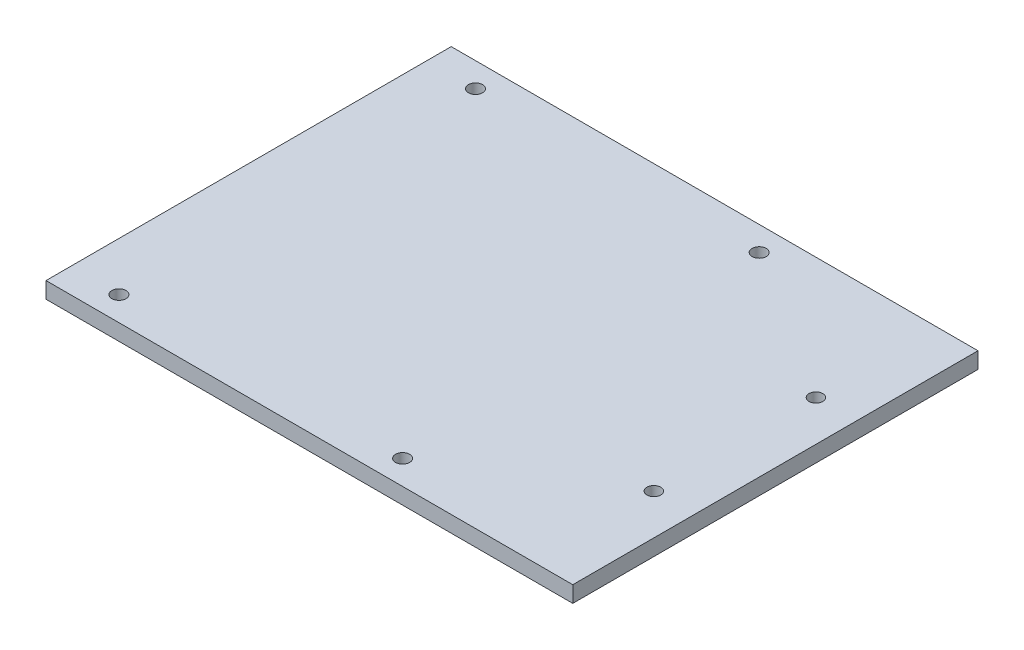
ISO-10303-21;
HEADER;
FILE_DESCRIPTION(('STEP AP214'),'2;1');
FILE_NAME('part.step','',(''),(''),'','','');
FILE_SCHEMA(('AUTOMOTIVE_DESIGN { 1 0 10303 214 1 1 1 1 }'));
ENDSEC;
DATA;
#1=APPLICATION_CONTEXT('core data for automotive mechanical design processes');
#2=APPLICATION_PROTOCOL_DEFINITION('international standard','automotive_design',2000,#1);
#3=PRODUCT_CONTEXT('',#1,'mechanical');
#4=PRODUCT('Part','Part','',(#3));
#5=PRODUCT_RELATED_PRODUCT_CATEGORY('part','',(#4));
#6=PRODUCT_DEFINITION_FORMATION('','',#4);
#7=PRODUCT_DEFINITION_CONTEXT('part definition',#1,'design');
#8=PRODUCT_DEFINITION('design','',#6,#7);
#9=PRODUCT_DEFINITION_SHAPE('','',#8);
#10=(LENGTH_UNIT() NAMED_UNIT(*) SI_UNIT(.MILLI.,.METRE.));
#11=(NAMED_UNIT(*) PLANE_ANGLE_UNIT() SI_UNIT($,.RADIAN.));
#12=(NAMED_UNIT(*) SI_UNIT($,.STERADIAN.) SOLID_ANGLE_UNIT());
#13=UNCERTAINTY_MEASURE_WITH_UNIT(LENGTH_MEASURE(1.E-05),#10,'distance_accuracy_value','');
#14=(GEOMETRIC_REPRESENTATION_CONTEXT(3) GLOBAL_UNCERTAINTY_ASSIGNED_CONTEXT((#13)) GLOBAL_UNIT_ASSIGNED_CONTEXT((#10,
#11,#12)) REPRESENTATION_CONTEXT('',''));
#15=CARTESIAN_POINT('',(0.,0.,0.));
#16=DIRECTION('',(0.,0.,1.));
#17=DIRECTION('',(1.,0.,0.));
#18=AXIS2_PLACEMENT_3D('',#15,#16,#17);
#19=CARTESIAN_POINT('',(0.,4.,0.));
#20=DIRECTION('',(1.,0.,0.));
#21=DIRECTION('',(0.,0.,-1.));
#22=AXIS2_PLACEMENT_3D('',#19,#20,#21);
#23=PLANE('',#22);
#24=DIRECTION('',(0.,0.,1.));
#25=VECTOR('',#24,1.);
#26=CARTESIAN_POINT('',(0.,0.,0.));
#27=LINE('',#26,#25);
#28=CARTESIAN_POINT('',(0.,0.,-100.));
#29=VERTEX_POINT('',#28);
#30=CARTESIAN_POINT('',(0.,0.,-50.));
#31=VERTEX_POINT('',#30);
#32=EDGE_CURVE('E175',#29,#31,#27,.T.);
#33=ORIENTED_EDGE('',*,*,#32,.T.);
#34=CARTESIAN_POINT('',(0.,0.,0.));
#35=VERTEX_POINT('',#34);
#36=EDGE_CURVE('E158',#31,#35,#27,.T.);
#37=ORIENTED_EDGE('',*,*,#36,.T.);
#38=DIRECTION('',(0.,-1.,0.));
#39=VECTOR('',#38,1.);
#40=CARTESIAN_POINT('',(0.,4.,0.));
#41=LINE('',#40,#39);
#42=CARTESIAN_POINT('',(0.,4.,0.));
#43=VERTEX_POINT('',#42);
#44=EDGE_CURVE('E11',#43,#35,#41,.T.);
#45=ORIENTED_EDGE('',*,*,#44,.F.);
#46=DIRECTION('',(0.,0.,1.));
#47=VECTOR('',#46,1.);
#48=CARTESIAN_POINT('',(0.,4.,0.));
#49=LINE('',#48,#47);
#50=CARTESIAN_POINT('',(0.,4.,-100.));
#51=VERTEX_POINT('',#50);
#52=EDGE_CURVE('E164',#51,#43,#49,.T.);
#53=ORIENTED_EDGE('',*,*,#52,.F.);
#54=DIRECTION('',(0.,-1.,0.));
#55=VECTOR('',#54,1.);
#56=CARTESIAN_POINT('',(0.,4.,-100.));
#57=LINE('',#56,#55);
#58=EDGE_CURVE('E174',#51,#29,#57,.T.);
#59=ORIENTED_EDGE('',*,*,#58,.T.);
#60=EDGE_LOOP('',(#33,#37,#45,#53,#59));
#61=FACE_BOUND('',#60,.T.);
#62=ADVANCED_FACE('F45',(#61),#23,.F.);
#63=CARTESIAN_POINT('',(0.,4.,0.));
#64=DIRECTION('',(0.,0.,-1.));
#65=DIRECTION('',(-1.,0.,0.));
#66=AXIS2_PLACEMENT_3D('',#63,#64,#65);
#67=PLANE('',#66);
#68=DIRECTION('',(1.,0.,0.));
#69=VECTOR('',#68,1.);
#70=CARTESIAN_POINT('',(0.,0.,0.));
#71=LINE('',#70,#69);
#72=CARTESIAN_POINT('',(130.,0.,0.));
#73=VERTEX_POINT('',#72);
#74=EDGE_CURVE('E178',#35,#73,#71,.T.);
#75=ORIENTED_EDGE('',*,*,#74,.T.);
#76=DIRECTION('',(0.,-1.,0.));
#77=VECTOR('',#76,1.);
#78=CARTESIAN_POINT('',(130.,4.,0.));
#79=LINE('',#78,#77);
#80=CARTESIAN_POINT('',(130.,4.,0.));
#81=VERTEX_POINT('',#80);
#82=EDGE_CURVE('E53',#81,#73,#79,.T.);
#83=ORIENTED_EDGE('',*,*,#82,.F.);
#84=DIRECTION('',(1.,0.,0.));
#85=VECTOR('',#84,1.);
#86=CARTESIAN_POINT('',(0.,4.,0.));
#87=LINE('',#86,#85);
#88=EDGE_CURVE('E167',#43,#81,#87,.T.);
#89=ORIENTED_EDGE('',*,*,#88,.F.);
#90=ORIENTED_EDGE('',*,*,#44,.T.);
#91=EDGE_LOOP('',(#75,#83,#89,#90));
#92=FACE_BOUND('',#91,.T.);
#93=ADVANCED_FACE('F281',(#92),#67,.F.);
#94=CARTESIAN_POINT('',(130.,4.,0.));
#95=DIRECTION('',(-1.,0.,0.));
#96=DIRECTION('',(0.,0.,1.));
#97=AXIS2_PLACEMENT_3D('',#94,#95,#96);
#98=PLANE('',#97);
#99=DIRECTION('',(0.,0.,-1.));
#100=VECTOR('',#99,1.);
#101=CARTESIAN_POINT('',(130.,0.,0.));
#102=LINE('',#101,#100);
#103=CARTESIAN_POINT('',(130.,0.,-100.));
#104=VERTEX_POINT('',#103);
#105=EDGE_CURVE('E180',#73,#104,#102,.T.);
#106=ORIENTED_EDGE('',*,*,#105,.T.);
#107=DIRECTION('',(0.,-1.,0.));
#108=VECTOR('',#107,1.);
#109=CARTESIAN_POINT('',(130.,4.,-100.));
#110=LINE('',#109,#108);
#111=CARTESIAN_POINT('',(130.,4.,-100.));
#112=VERTEX_POINT('',#111);
#113=EDGE_CURVE('E185',#112,#104,#110,.T.);
#114=ORIENTED_EDGE('',*,*,#113,.F.);
#115=DIRECTION('',(0.,0.,-1.));
#116=VECTOR('',#115,1.);
#117=CARTESIAN_POINT('',(130.,4.,0.));
#118=LINE('',#117,#116);
#119=EDGE_CURVE('E170',#81,#112,#118,.T.);
#120=ORIENTED_EDGE('',*,*,#119,.F.);
#121=ORIENTED_EDGE('',*,*,#82,.T.);
#122=EDGE_LOOP('',(#106,#114,#120,#121));
#123=FACE_BOUND('',#122,.T.);
#124=ADVANCED_FACE('F285',(#123),#98,.F.);
#125=CARTESIAN_POINT('',(0.,4.,-100.));
#126=DIRECTION('',(0.,0.,1.));
#127=DIRECTION('',(1.,0.,0.));
#128=AXIS2_PLACEMENT_3D('',#125,#126,#127);
#129=PLANE('',#128);
#130=DIRECTION('',(-1.,0.,0.));
#131=VECTOR('',#130,1.);
#132=CARTESIAN_POINT('',(0.,0.,-100.));
#133=LINE('',#132,#131);
#134=EDGE_CURVE('E168',#104,#29,#133,.T.);
#135=ORIENTED_EDGE('',*,*,#134,.T.);
#136=ORIENTED_EDGE('',*,*,#58,.F.);
#137=DIRECTION('',(-1.,0.,0.));
#138=VECTOR('',#137,1.);
#139=CARTESIAN_POINT('',(0.,4.,-100.));
#140=LINE('',#139,#138);
#141=EDGE_CURVE('E172',#112,#51,#140,.T.);
#142=ORIENTED_EDGE('',*,*,#141,.F.);
#143=ORIENTED_EDGE('',*,*,#113,.T.);
#144=EDGE_LOOP('',(#135,#136,#142,#143));
#145=FACE_BOUND('',#144,.T.);
#146=ADVANCED_FACE('F269',(#145),#129,.F.);
#147=CARTESIAN_POINT('',(0.,4.,0.));
#148=DIRECTION('',(0.,-1.,0.));
#149=DIRECTION('',(0.,0.,-1.));
#150=AXIS2_PLACEMENT_3D('',#147,#148,#149);
#151=PLANE('',#150);
#152=CARTESIAN_POINT('',(12.,4.,-94.));
#153=DIRECTION('',(0.,1.,0.));
#154=DIRECTION('',(0.,0.,-1.));
#155=AXIS2_PLACEMENT_3D('',#152,#153,#154);
#156=CIRCLE('',#155,1.75);
#157=CARTESIAN_POINT('',(12.,4.,-95.75));
#158=VERTEX_POINT('',#157);
#159=EDGE_CURVE('E255',#158,#158,#156,.T.);
#160=ORIENTED_EDGE('',*,*,#159,.F.);
#161=EDGE_LOOP('',(#160));
#162=FACE_BOUND('',#161,.T.);
#163=CARTESIAN_POINT('',(82.,4.,-94.));
#164=DIRECTION('',(0.,1.,0.));
#165=DIRECTION('',(0.,0.,-1.));
#166=AXIS2_PLACEMENT_3D('',#163,#164,#165);
#167=CIRCLE('',#166,1.75);
#168=CARTESIAN_POINT('',(82.,4.,-95.75));
#169=VERTEX_POINT('',#168);
#170=EDGE_CURVE('E258',#169,#169,#167,.T.);
#171=ORIENTED_EDGE('',*,*,#170,.F.);
#172=EDGE_LOOP('',(#171));
#173=FACE_BOUND('',#172,.T.);
#174=CARTESIAN_POINT('',(82.,4.,-6.));
#175=DIRECTION('',(0.,1.,0.));
#176=DIRECTION('',(0.,0.,1.));
#177=AXIS2_PLACEMENT_3D('',#174,#175,#176);
#178=CIRCLE('',#177,1.75);
#179=CARTESIAN_POINT('',(82.,4.,-4.25));
#180=VERTEX_POINT('',#179);
#181=EDGE_CURVE('E254',#180,#180,#178,.T.);
#182=ORIENTED_EDGE('',*,*,#181,.F.);
#183=EDGE_LOOP('',(#182));
#184=FACE_BOUND('',#183,.T.);
#185=CARTESIAN_POINT('',(12.,4.,-6.00000000000001));
#186=DIRECTION('',(0.,1.,0.));
#187=DIRECTION('',(0.,0.,1.));
#188=AXIS2_PLACEMENT_3D('',#185,#186,#187);
#189=CIRCLE('',#188,1.75);
#190=CARTESIAN_POINT('',(12.,4.,-4.25000000000001));
#191=VERTEX_POINT('',#190);
#192=EDGE_CURVE('E194',#191,#191,#189,.T.);
#193=ORIENTED_EDGE('',*,*,#192,.F.);
#194=EDGE_LOOP('',(#193));
#195=FACE_BOUND('',#194,.T.);
#196=CARTESIAN_POINT('',(120.,4.,-30.));
#197=DIRECTION('',(0.,1.,0.));
#198=DIRECTION('',(0.,0.,1.));
#199=AXIS2_PLACEMENT_3D('',#196,#197,#198);
#200=CIRCLE('',#199,1.70000000000001);
#201=CARTESIAN_POINT('',(120.,4.,-28.3));
#202=VERTEX_POINT('',#201);
#203=EDGE_CURVE('E159',#202,#202,#200,.T.);
#204=ORIENTED_EDGE('',*,*,#203,.F.);
#205=EDGE_LOOP('',(#204));
#206=FACE_BOUND('',#205,.T.);
#207=CARTESIAN_POINT('',(120.,4.,-70.));
#208=DIRECTION('',(0.,1.,0.));
#209=DIRECTION('',(0.,0.,1.));
#210=AXIS2_PLACEMENT_3D('',#207,#208,#209);
#211=CIRCLE('',#210,1.70000000000001);
#212=CARTESIAN_POINT('',(120.,4.,-68.3));
#213=VERTEX_POINT('',#212);
#214=EDGE_CURVE('E149',#213,#213,#211,.T.);
#215=ORIENTED_EDGE('',*,*,#214,.F.);
#216=EDGE_LOOP('',(#215));
#217=FACE_BOUND('',#216,.T.);
#218=ORIENTED_EDGE('',*,*,#52,.T.);
#219=ORIENTED_EDGE('',*,*,#88,.T.);
#220=ORIENTED_EDGE('',*,*,#119,.T.);
#221=ORIENTED_EDGE('',*,*,#141,.T.);
#222=EDGE_LOOP('',(#218,#219,#220,#221));
#223=FACE_BOUND('',#222,.T.);
#224=ADVANCED_FACE('F266',(#162,#173,#184,#195,#206,#217,#223),#151,.F.);
#225=CARTESIAN_POINT('',(0.,0.,0.));
#226=DIRECTION('',(0.,-1.,0.));
#227=DIRECTION('',(0.,0.,-1.));
#228=AXIS2_PLACEMENT_3D('',#225,#226,#227);
#229=PLANE('',#228);
#230=CARTESIAN_POINT('',(12.,0.,-94.));
#231=DIRECTION('',(0.,-1.,0.));
#232=DIRECTION('',(0.,0.,-1.));
#233=AXIS2_PLACEMENT_3D('',#230,#231,#232);
#234=CIRCLE('',#233,1.75);
#235=CARTESIAN_POINT('',(12.,0.,-95.75));
#236=VERTEX_POINT('',#235);
#237=EDGE_CURVE('E48',#236,#236,#234,.T.);
#238=ORIENTED_EDGE('',*,*,#237,.F.);
#239=EDGE_LOOP('',(#238));
#240=FACE_BOUND('',#239,.T.);
#241=CARTESIAN_POINT('',(82.,0.,-94.));
#242=DIRECTION('',(0.,-1.,0.));
#243=DIRECTION('',(0.,0.,-1.));
#244=AXIS2_PLACEMENT_3D('',#241,#242,#243);
#245=CIRCLE('',#244,1.75);
#246=CARTESIAN_POINT('',(82.,0.,-95.75));
#247=VERTEX_POINT('',#246);
#248=EDGE_CURVE('E196',#247,#247,#245,.T.);
#249=ORIENTED_EDGE('',*,*,#248,.F.);
#250=EDGE_LOOP('',(#249));
#251=FACE_BOUND('',#250,.T.);
#252=CARTESIAN_POINT('',(82.,0.,-6.));
#253=DIRECTION('',(0.,-1.,0.));
#254=DIRECTION('',(0.,0.,-1.));
#255=AXIS2_PLACEMENT_3D('',#252,#253,#254);
#256=CIRCLE('',#255,1.75);
#257=CARTESIAN_POINT('',(82.,0.,-7.75));
#258=VERTEX_POINT('',#257);
#259=EDGE_CURVE('E193',#258,#258,#256,.T.);
#260=ORIENTED_EDGE('',*,*,#259,.F.);
#261=EDGE_LOOP('',(#260));
#262=FACE_BOUND('',#261,.T.);
#263=CARTESIAN_POINT('',(12.,0.,-6.00000000000001));
#264=DIRECTION('',(0.,-1.,0.));
#265=DIRECTION('',(0.,0.,-1.));
#266=AXIS2_PLACEMENT_3D('',#263,#264,#265);
#267=CIRCLE('',#266,1.75);
#268=CARTESIAN_POINT('',(12.,0.,-7.75000000000001));
#269=VERTEX_POINT('',#268);
#270=EDGE_CURVE('E190',#269,#269,#267,.T.);
#271=ORIENTED_EDGE('',*,*,#270,.F.);
#272=EDGE_LOOP('',(#271));
#273=FACE_BOUND('',#272,.T.);
#274=DIRECTION('',(0.5,0.,-0.866025403784439));
#275=VECTOR('',#274,1.);
#276=CARTESIAN_POINT('',(0.,0.,-50.));
#277=LINE('',#276,#275);
#278=CARTESIAN_POINT('',(12.5,0.,-71.650635094611));
#279=VERTEX_POINT('',#278);
#280=EDGE_CURVE('E145',#31,#279,#277,.T.);
#281=ORIENTED_EDGE('',*,*,#280,.F.);
#282=ORIENTED_EDGE('',*,*,#32,.F.);
#283=ORIENTED_EDGE('',*,*,#134,.F.);
#284=ORIENTED_EDGE('',*,*,#105,.F.);
#285=ORIENTED_EDGE('',*,*,#74,.F.);
#286=ORIENTED_EDGE('',*,*,#36,.F.);
#287=DIRECTION('',(-0.499999999999998,0.,-0.86602540378444));
#288=VECTOR('',#287,1.);
#289=CARTESIAN_POINT('',(12.5,0.,-28.349364905389));
#290=LINE('',#289,#288);
#291=CARTESIAN_POINT('',(12.5,0.,-28.349364905389));
#292=VERTEX_POINT('',#291);
#293=EDGE_CURVE('E61',#292,#31,#290,.T.);
#294=ORIENTED_EDGE('',*,*,#293,.F.);
#295=DIRECTION('',(-1.,0.,0.));
#296=VECTOR('',#295,1.);
#297=CARTESIAN_POINT('',(37.5,0.,-28.349364905389));
#298=LINE('',#297,#296);
#299=CARTESIAN_POINT('',(37.5,0.,-28.349364905389));
#300=VERTEX_POINT('',#299);
#301=EDGE_CURVE('E65',#300,#292,#298,.T.);
#302=ORIENTED_EDGE('',*,*,#301,.F.);
#303=DIRECTION('',(-0.5,0.,0.866025403784438));
#304=VECTOR('',#303,1.);
#305=CARTESIAN_POINT('',(50.,0.,-50.));
#306=LINE('',#305,#304);
#307=CARTESIAN_POINT('',(50.,0.,-50.));
#308=VERTEX_POINT('',#307);
#309=EDGE_CURVE('E212',#308,#300,#306,.T.);
#310=ORIENTED_EDGE('',*,*,#309,.F.);
#311=DIRECTION('',(0.5,0.,0.866025403784438));
#312=VECTOR('',#311,1.);
#313=CARTESIAN_POINT('',(37.5,0.,-71.650635094611));
#314=LINE('',#313,#312);
#315=CARTESIAN_POINT('',(37.5,0.,-71.650635094611));
#316=VERTEX_POINT('',#315);
#317=EDGE_CURVE('E205',#316,#308,#314,.T.);
#318=ORIENTED_EDGE('',*,*,#317,.F.);
#319=DIRECTION('',(1.,0.,0.));
#320=VECTOR('',#319,1.);
#321=CARTESIAN_POINT('',(12.5,0.,-71.650635094611));
#322=LINE('',#321,#320);
#323=EDGE_CURVE('E203',#279,#316,#322,.T.);
#324=ORIENTED_EDGE('',*,*,#323,.F.);
#325=EDGE_LOOP('',(#281,#282,#283,#284,#285,#286,#294,#302,#310,#318,#324));
#326=FACE_BOUND('',#325,.T.);
#327=CARTESIAN_POINT('',(120.,0.,-30.));
#328=DIRECTION('',(0.,1.,0.));
#329=DIRECTION('',(0.,0.,1.));
#330=AXIS2_PLACEMENT_3D('',#327,#328,#329);
#331=CIRCLE('',#330,1.70000000000001);
#332=CARTESIAN_POINT('',(120.,0.,-28.3));
#333=VERTEX_POINT('',#332);
#334=EDGE_CURVE('E155',#333,#333,#331,.T.);
#335=ORIENTED_EDGE('',*,*,#334,.T.);
#336=EDGE_LOOP('',(#335));
#337=FACE_BOUND('',#336,.T.);
#338=CARTESIAN_POINT('',(120.,0.,-70.));
#339=DIRECTION('',(0.,1.,0.));
#340=DIRECTION('',(0.,0.,1.));
#341=AXIS2_PLACEMENT_3D('',#338,#339,#340);
#342=CIRCLE('',#341,1.70000000000001);
#343=CARTESIAN_POINT('',(120.,0.,-68.3));
#344=VERTEX_POINT('',#343);
#345=EDGE_CURVE('E146',#344,#344,#342,.T.);
#346=ORIENTED_EDGE('',*,*,#345,.T.);
#347=EDGE_LOOP('',(#346));
#348=FACE_BOUND('',#347,.T.);
#349=ADVANCED_FACE('F232',(#240,#251,#262,#273,#326,#337,#348),#229,.T.);
#350=CARTESIAN_POINT('',(120.,0.,-70.));
#351=DIRECTION('',(0.,1.,0.));
#352=DIRECTION('',(0.,0.,1.));
#353=AXIS2_PLACEMENT_3D('',#350,#351,#352);
#354=CYLINDRICAL_SURFACE('',#353,1.70000000000001);
#355=ORIENTED_EDGE('',*,*,#345,.F.);
#356=EDGE_LOOP('',(#355));
#357=FACE_BOUND('',#356,.T.);
#358=ORIENTED_EDGE('',*,*,#214,.T.);
#359=EDGE_LOOP('',(#358));
#360=FACE_BOUND('',#359,.T.);
#361=ADVANCED_FACE('F329',(#357,#360),#354,.F.);
#362=CARTESIAN_POINT('',(120.,0.,-30.));
#363=DIRECTION('',(0.,1.,0.));
#364=DIRECTION('',(0.,0.,1.));
#365=AXIS2_PLACEMENT_3D('',#362,#363,#364);
#366=CYLINDRICAL_SURFACE('',#365,1.70000000000001);
#367=ORIENTED_EDGE('',*,*,#334,.F.);
#368=EDGE_LOOP('',(#367));
#369=FACE_BOUND('',#368,.T.);
#370=ORIENTED_EDGE('',*,*,#203,.T.);
#371=EDGE_LOOP('',(#370));
#372=FACE_BOUND('',#371,.T.);
#373=ADVANCED_FACE('F338',(#369,#372),#366,.F.);
#374=CARTESIAN_POINT('',(0.,-16.,-50.));
#375=DIRECTION('',(0.866025403784439,0.,0.5));
#376=DIRECTION('',(0.5,0.,-0.866025403784439));
#377=AXIS2_PLACEMENT_3D('',#374,#375,#376);
#378=PLANE('',#377);
#379=ORIENTED_EDGE('',*,*,#280,.T.);
#380=DIRECTION('',(0.,1.,0.));
#381=VECTOR('',#380,1.);
#382=CARTESIAN_POINT('',(12.5,-16.,-71.650635094611));
#383=LINE('',#382,#381);
#384=CARTESIAN_POINT('',(12.5,-16.,-71.650635094611));
#385=VERTEX_POINT('',#384);
#386=EDGE_CURVE('E127',#385,#279,#383,.T.);
#387=ORIENTED_EDGE('',*,*,#386,.F.);
#388=DIRECTION('',(0.5,0.,-0.866025403784439));
#389=VECTOR('',#388,1.);
#390=CARTESIAN_POINT('',(0.,-16.,-50.));
#391=LINE('',#390,#389);
#392=CARTESIAN_POINT('',(0.,-16.,-50.));
#393=VERTEX_POINT('',#392);
#394=EDGE_CURVE('E134',#393,#385,#391,.T.);
#395=ORIENTED_EDGE('',*,*,#394,.F.);
#396=DIRECTION('',(0.,1.,0.));
#397=VECTOR('',#396,1.);
#398=CARTESIAN_POINT('',(0.,-16.,-50.));
#399=LINE('',#398,#397);
#400=EDGE_CURVE('E216',#393,#31,#399,.T.);
#401=ORIENTED_EDGE('',*,*,#400,.T.);
#402=EDGE_LOOP('',(#379,#387,#395,#401));
#403=FACE_BOUND('',#402,.T.);
#404=ADVANCED_FACE('F144',(#403),#378,.F.);
#405=CARTESIAN_POINT('',(12.5,-16.,-71.650635094611));
#406=DIRECTION('',(0.,0.,1.));
#407=DIRECTION('',(1.,0.,0.));
#408=AXIS2_PLACEMENT_3D('',#405,#406,#407);
#409=PLANE('',#408);
#410=ORIENTED_EDGE('',*,*,#323,.T.);
#411=DIRECTION('',(0.,1.,0.));
#412=VECTOR('',#411,1.);
#413=CARTESIAN_POINT('',(37.5,-16.,-71.650635094611));
#414=LINE('',#413,#412);
#415=CARTESIAN_POINT('',(37.5,-16.,-71.650635094611));
#416=VERTEX_POINT('',#415);
#417=EDGE_CURVE('E130',#416,#316,#414,.T.);
#418=ORIENTED_EDGE('',*,*,#417,.F.);
#419=DIRECTION('',(1.,0.,0.));
#420=VECTOR('',#419,1.);
#421=CARTESIAN_POINT('',(12.5,-16.,-71.650635094611));
#422=LINE('',#421,#420);
#423=EDGE_CURVE('E122',#385,#416,#422,.T.);
#424=ORIENTED_EDGE('',*,*,#423,.F.);
#425=ORIENTED_EDGE('',*,*,#386,.T.);
#426=EDGE_LOOP('',(#410,#418,#424,#425));
#427=FACE_BOUND('',#426,.T.);
#428=ADVANCED_FACE('F125',(#427),#409,.F.);
#429=CARTESIAN_POINT('',(37.5,-16.,-71.650635094611));
#430=DIRECTION('',(-0.866025403784438,0.,0.5));
#431=DIRECTION('',(0.5,0.,0.866025403784439));
#432=AXIS2_PLACEMENT_3D('',#429,#430,#431);
#433=PLANE('',#432);
#434=ORIENTED_EDGE('',*,*,#317,.T.);
#435=DIRECTION('',(0.,1.,0.));
#436=VECTOR('',#435,1.);
#437=CARTESIAN_POINT('',(50.,-16.,-50.));
#438=LINE('',#437,#436);
#439=CARTESIAN_POINT('',(50.,-16.,-50.));
#440=VERTEX_POINT('',#439);
#441=EDGE_CURVE('E151',#440,#308,#438,.T.);
#442=ORIENTED_EDGE('',*,*,#441,.F.);
#443=DIRECTION('',(0.5,0.,0.866025403784438));
#444=VECTOR('',#443,1.);
#445=CARTESIAN_POINT('',(37.5,-16.,-71.650635094611));
#446=LINE('',#445,#444);
#447=EDGE_CURVE('E133',#416,#440,#446,.T.);
#448=ORIENTED_EDGE('',*,*,#447,.F.);
#449=ORIENTED_EDGE('',*,*,#417,.T.);
#450=EDGE_LOOP('',(#434,#442,#448,#449));
#451=FACE_BOUND('',#450,.T.);
#452=ADVANCED_FACE('F231',(#451),#433,.F.);
#453=CARTESIAN_POINT('',(50.,-16.,-50.));
#454=DIRECTION('',(-0.866025403784439,0.,-0.5));
#455=DIRECTION('',(-0.5,0.,0.866025403784438));
#456=AXIS2_PLACEMENT_3D('',#453,#454,#455);
#457=PLANE('',#456);
#458=ORIENTED_EDGE('',*,*,#309,.T.);
#459=DIRECTION('',(0.,1.,0.));
#460=VECTOR('',#459,1.);
#461=CARTESIAN_POINT('',(37.5,-16.,-28.349364905389));
#462=LINE('',#461,#460);
#463=CARTESIAN_POINT('',(37.5,-16.,-28.349364905389));
#464=VERTEX_POINT('',#463);
#465=EDGE_CURVE('E221',#464,#300,#462,.T.);
#466=ORIENTED_EDGE('',*,*,#465,.F.);
#467=DIRECTION('',(-0.5,0.,0.866025403784438));
#468=VECTOR('',#467,1.);
#469=CARTESIAN_POINT('',(50.,-16.,-50.));
#470=LINE('',#469,#468);
#471=EDGE_CURVE('E229',#440,#464,#470,.T.);
#472=ORIENTED_EDGE('',*,*,#471,.F.);
#473=ORIENTED_EDGE('',*,*,#441,.T.);
#474=EDGE_LOOP('',(#458,#466,#472,#473));
#475=FACE_BOUND('',#474,.T.);
#476=ADVANCED_FACE('F227',(#475),#457,.F.);
#477=CARTESIAN_POINT('',(37.5,-16.,-28.349364905389));
#478=DIRECTION('',(0.,0.,-1.));
#479=DIRECTION('',(-1.,0.,0.));
#480=AXIS2_PLACEMENT_3D('',#477,#478,#479);
#481=PLANE('',#480);
#482=ORIENTED_EDGE('',*,*,#301,.T.);
#483=DIRECTION('',(0.,1.,0.));
#484=VECTOR('',#483,1.);
#485=CARTESIAN_POINT('',(12.5,-16.,-28.349364905389));
#486=LINE('',#485,#484);
#487=CARTESIAN_POINT('',(12.5,-16.,-28.349364905389));
#488=VERTEX_POINT('',#487);
#489=EDGE_CURVE('E218',#488,#292,#486,.T.);
#490=ORIENTED_EDGE('',*,*,#489,.F.);
#491=DIRECTION('',(-1.,0.,0.));
#492=VECTOR('',#491,1.);
#493=CARTESIAN_POINT('',(37.5,-16.,-28.349364905389));
#494=LINE('',#493,#492);
#495=EDGE_CURVE('E248',#464,#488,#494,.T.);
#496=ORIENTED_EDGE('',*,*,#495,.F.);
#497=ORIENTED_EDGE('',*,*,#465,.T.);
#498=EDGE_LOOP('',(#482,#490,#496,#497));
#499=FACE_BOUND('',#498,.T.);
#500=ADVANCED_FACE('F247',(#499),#481,.F.);
#501=CARTESIAN_POINT('',(12.5,-16.,-28.349364905389));
#502=DIRECTION('',(0.86602540378444,0.,-0.499999999999998));
#503=DIRECTION('',(-0.499999999999998,0.,-0.86602540378444));
#504=AXIS2_PLACEMENT_3D('',#501,#502,#503);
#505=PLANE('',#504);
#506=ORIENTED_EDGE('',*,*,#293,.T.);
#507=ORIENTED_EDGE('',*,*,#400,.F.);
#508=DIRECTION('',(-0.499999999999998,0.,-0.86602540378444));
#509=VECTOR('',#508,1.);
#510=CARTESIAN_POINT('',(12.5,-16.,-28.349364905389));
#511=LINE('',#510,#509);
#512=EDGE_CURVE('E139',#488,#393,#511,.T.);
#513=ORIENTED_EDGE('',*,*,#512,.F.);
#514=ORIENTED_EDGE('',*,*,#489,.T.);
#515=EDGE_LOOP('',(#506,#507,#513,#514));
#516=FACE_BOUND('',#515,.T.);
#517=ADVANCED_FACE('F243',(#516),#505,.F.);
#518=CARTESIAN_POINT('',(0.,-16.,0.));
#519=DIRECTION('',(0.,-1.,0.));
#520=DIRECTION('',(0.,0.,-1.));
#521=AXIS2_PLACEMENT_3D('',#518,#519,#520);
#522=PLANE('',#521);
#523=ORIENTED_EDGE('',*,*,#394,.T.);
#524=ORIENTED_EDGE('',*,*,#423,.T.);
#525=ORIENTED_EDGE('',*,*,#447,.T.);
#526=ORIENTED_EDGE('',*,*,#471,.T.);
#527=ORIENTED_EDGE('',*,*,#495,.T.);
#528=ORIENTED_EDGE('',*,*,#512,.T.);
#529=EDGE_LOOP('',(#523,#524,#525,#526,#527,#528));
#530=FACE_BOUND('',#529,.T.);
#531=ADVANCED_FACE('F137',(#530),#522,.T.);
#532=CARTESIAN_POINT('',(12.,-16.,-6.00000000000001));
#533=DIRECTION('',(0.,1.,0.));
#534=DIRECTION('',(0.,0.,1.));
#535=AXIS2_PLACEMENT_3D('',#532,#533,#534);
#536=CYLINDRICAL_SURFACE('',#535,1.75);
#537=ORIENTED_EDGE('',*,*,#270,.T.);
#538=EDGE_LOOP('',(#537));
#539=FACE_BOUND('',#538,.T.);
#540=ORIENTED_EDGE('',*,*,#192,.T.);
#541=EDGE_LOOP('',(#540));
#542=FACE_BOUND('',#541,.T.);
#543=ADVANCED_FACE('F402',(#539,#542),#536,.F.);
#544=CARTESIAN_POINT('',(82.,-16.,-6.));
#545=DIRECTION('',(0.,1.,0.));
#546=DIRECTION('',(0.,0.,1.));
#547=AXIS2_PLACEMENT_3D('',#544,#545,#546);
#548=CYLINDRICAL_SURFACE('',#547,1.75);
#549=ORIENTED_EDGE('',*,*,#259,.T.);
#550=EDGE_LOOP('',(#549));
#551=FACE_BOUND('',#550,.T.);
#552=ORIENTED_EDGE('',*,*,#181,.T.);
#553=EDGE_LOOP('',(#552));
#554=FACE_BOUND('',#553,.T.);
#555=ADVANCED_FACE('F264',(#551,#554),#548,.F.);
#556=CARTESIAN_POINT('',(82.,-16.,-94.));
#557=DIRECTION('',(0.,1.,0.));
#558=DIRECTION('',(0.,0.,1.));
#559=AXIS2_PLACEMENT_3D('',#556,#557,#558);
#560=CYLINDRICAL_SURFACE('',#559,1.75);
#561=ORIENTED_EDGE('',*,*,#248,.T.);
#562=EDGE_LOOP('',(#561));
#563=FACE_BOUND('',#562,.T.);
#564=ORIENTED_EDGE('',*,*,#170,.T.);
#565=EDGE_LOOP('',(#564));
#566=FACE_BOUND('',#565,.T.);
#567=ADVANCED_FACE('F419',(#563,#566),#560,.F.);
#568=CARTESIAN_POINT('',(12.,-16.,-94.));
#569=DIRECTION('',(0.,1.,0.));
#570=DIRECTION('',(0.,0.,1.));
#571=AXIS2_PLACEMENT_3D('',#568,#569,#570);
#572=CYLINDRICAL_SURFACE('',#571,1.75);
#573=ORIENTED_EDGE('',*,*,#237,.T.);
#574=EDGE_LOOP('',(#573));
#575=FACE_BOUND('',#574,.T.);
#576=ORIENTED_EDGE('',*,*,#159,.T.);
#577=EDGE_LOOP('',(#576));
#578=FACE_BOUND('',#577,.T.);
#579=ADVANCED_FACE('F429',(#575,#578),#572,.F.);
#580=CLOSED_SHELL('',(#62,#93,#124,#146,#224,#349,#361,#373,#404,#428,#452,#476,#500,#517,#531,
#543,#555,#567,#579));
#581=MANIFOLD_SOLID_BREP('B2',#580);
#582=ADVANCED_BREP_SHAPE_REPRESENTATION('',(#18,#581),#14);
#583=SHAPE_DEFINITION_REPRESENTATION(#9,#582);
ENDSEC;
END-ISO-10303-21;
